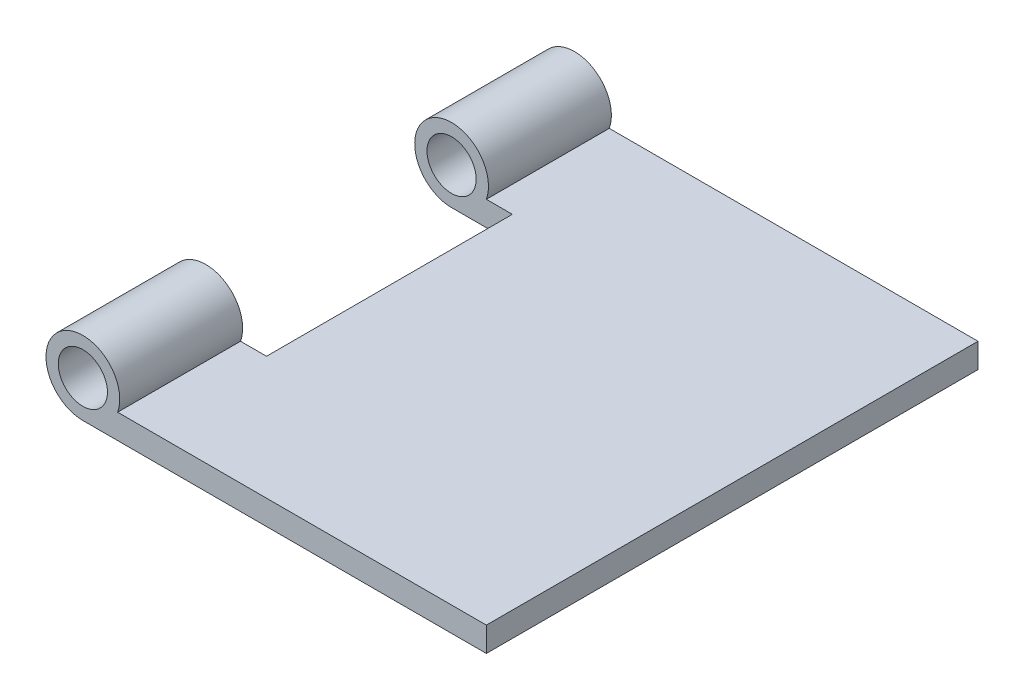
ISO-10303-21;
HEADER;
FILE_DESCRIPTION(('STEP AP214'),'2;1');
FILE_NAME('part.step','',(''),(''),'','','');
FILE_SCHEMA(('AUTOMOTIVE_DESIGN { 1 0 10303 214 1 1 1 1 }'));
ENDSEC;
DATA;
#1=APPLICATION_CONTEXT('core data for automotive mechanical design processes');
#2=APPLICATION_PROTOCOL_DEFINITION('international standard','automotive_design',2000,#1);
#3=PRODUCT_CONTEXT('',#1,'mechanical');
#4=PRODUCT('Part','Part','',(#3));
#5=PRODUCT_RELATED_PRODUCT_CATEGORY('part','',(#4));
#6=PRODUCT_DEFINITION_FORMATION('','',#4);
#7=PRODUCT_DEFINITION_CONTEXT('part definition',#1,'design');
#8=PRODUCT_DEFINITION('design','',#6,#7);
#9=PRODUCT_DEFINITION_SHAPE('','',#8);
#10=(LENGTH_UNIT() NAMED_UNIT(*) SI_UNIT(.MILLI.,.METRE.));
#11=(NAMED_UNIT(*) PLANE_ANGLE_UNIT() SI_UNIT($,.RADIAN.));
#12=(NAMED_UNIT(*) SI_UNIT($,.STERADIAN.) SOLID_ANGLE_UNIT());
#13=UNCERTAINTY_MEASURE_WITH_UNIT(LENGTH_MEASURE(1.E-05),#10,'distance_accuracy_value','');
#14=(GEOMETRIC_REPRESENTATION_CONTEXT(3) GLOBAL_UNCERTAINTY_ASSIGNED_CONTEXT((#13)) GLOBAL_UNIT_ASSIGNED_CONTEXT((#10,
#11,#12)) REPRESENTATION_CONTEXT('',''));
#15=CARTESIAN_POINT('',(0.,0.,0.));
#16=DIRECTION('',(0.,0.,1.));
#17=DIRECTION('',(1.,0.,0.));
#18=AXIS2_PLACEMENT_3D('',#15,#16,#17);
#19=CARTESIAN_POINT('',(0.,0.,40.));
#20=DIRECTION('',(0.,0.,-1.));
#21=DIRECTION('',(-1.,0.,0.));
#22=AXIS2_PLACEMENT_3D('',#19,#20,#21);
#23=CYLINDRICAL_SURFACE('',#22,3.);
#24=DIRECTION('',(0.,0.,-1.));
#25=VECTOR('',#24,1.);
#26=CARTESIAN_POINT('',(0.,-3.,40.));
#27=LINE('',#26,#25);
#28=CARTESIAN_POINT('',(0.,-3.,10.));
#29=VERTEX_POINT('',#28);
#30=CARTESIAN_POINT('',(0.,-3.,0.));
#31=VERTEX_POINT('',#30);
#32=EDGE_CURVE('E166',#29,#31,#27,.T.);
#33=ORIENTED_EDGE('',*,*,#32,.F.);
#34=CARTESIAN_POINT('',(0.,0.,10.));
#35=DIRECTION('',(0.,0.,-1.));
#36=DIRECTION('',(-1.,0.,0.));
#37=AXIS2_PLACEMENT_3D('',#34,#35,#36);
#38=CIRCLE('',#37,3.);
#39=CARTESIAN_POINT('',(2.82842712474619,-1.,10.));
#40=VERTEX_POINT('',#39);
#41=EDGE_CURVE('E135',#29,#40,#38,.T.);
#42=ORIENTED_EDGE('',*,*,#41,.T.);
#43=DIRECTION('',(0.,0.,-1.));
#44=VECTOR('',#43,1.);
#45=CARTESIAN_POINT('',(2.82842712474619,-1.,40.));
#46=LINE('',#45,#44);
#47=CARTESIAN_POINT('',(2.82842712474619,-1.,0.));
#48=VERTEX_POINT('',#47);
#49=EDGE_CURVE('E78',#40,#48,#46,.T.);
#50=ORIENTED_EDGE('',*,*,#49,.T.);
#51=CARTESIAN_POINT('',(0.,0.,0.));
#52=DIRECTION('',(0.,0.,1.));
#53=DIRECTION('',(1.,0.,0.));
#54=AXIS2_PLACEMENT_3D('',#51,#52,#53);
#55=CIRCLE('',#54,3.);
#56=EDGE_CURVE('E141',#48,#31,#55,.T.);
#57=ORIENTED_EDGE('',*,*,#56,.T.);
#58=EDGE_LOOP('',(#33,#42,#50,#57));
#59=FACE_BOUND('',#58,.T.);
#60=ADVANCED_FACE('F32',(#59),#23,.T.);
#61=CARTESIAN_POINT('',(0.,0.,40.));
#62=DIRECTION('',(0.,0.,-1.));
#63=DIRECTION('',(-1.,0.,0.));
#64=AXIS2_PLACEMENT_3D('',#61,#62,#63);
#65=CYLINDRICAL_SURFACE('',#64,2.);
#66=CARTESIAN_POINT('',(0.,0.,10.));
#67=DIRECTION('',(0.,0.,-1.));
#68=DIRECTION('',(-1.,0.,0.));
#69=AXIS2_PLACEMENT_3D('',#66,#67,#68);
#70=CIRCLE('',#69,2.);
#71=CARTESIAN_POINT('',(-2.,0.,10.));
#72=VERTEX_POINT('',#71);
#73=EDGE_CURVE('E126',#72,#72,#70,.T.);
#74=ORIENTED_EDGE('',*,*,#73,.F.);
#75=EDGE_LOOP('',(#74));
#76=FACE_BOUND('',#75,.T.);
#77=CARTESIAN_POINT('',(0.,0.,0.));
#78=DIRECTION('',(0.,0.,1.));
#79=DIRECTION('',(1.,0.,0.));
#80=AXIS2_PLACEMENT_3D('',#77,#78,#79);
#81=CIRCLE('',#80,2.);
#82=CARTESIAN_POINT('',(2.,0.,0.));
#83=VERTEX_POINT('',#82);
#84=EDGE_CURVE('E117',#83,#83,#81,.T.);
#85=ORIENTED_EDGE('',*,*,#84,.F.);
#86=EDGE_LOOP('',(#85));
#87=FACE_BOUND('',#86,.T.);
#88=ADVANCED_FACE('F200',(#76,#87),#65,.F.);
#89=CARTESIAN_POINT('',(0.,0.,40.));
#90=DIRECTION('',(0.,0.,1.));
#91=DIRECTION('',(1.,0.,0.));
#92=AXIS2_PLACEMENT_3D('',#89,#90,#91);
#93=PLANE('',#92);
#94=CARTESIAN_POINT('',(0.,0.,40.));
#95=DIRECTION('',(0.,0.,1.));
#96=DIRECTION('',(1.,0.,0.));
#97=AXIS2_PLACEMENT_3D('',#94,#95,#96);
#98=CIRCLE('',#97,3.);
#99=CARTESIAN_POINT('',(2.82842712474619,-1.,40.));
#100=VERTEX_POINT('',#99);
#101=CARTESIAN_POINT('',(0.,-3.,40.));
#102=VERTEX_POINT('',#101);
#103=EDGE_CURVE('E144',#100,#102,#98,.T.);
#104=ORIENTED_EDGE('',*,*,#103,.T.);
#105=DIRECTION('',(1.,0.,0.));
#106=VECTOR('',#105,1.);
#107=CARTESIAN_POINT('',(0.,-3.,40.));
#108=LINE('',#107,#106);
#109=CARTESIAN_POINT('',(32.8284271247462,-3.,40.));
#110=VERTEX_POINT('',#109);
#111=EDGE_CURVE('E86',#102,#110,#108,.T.);
#112=ORIENTED_EDGE('',*,*,#111,.T.);
#113=DIRECTION('',(0.,1.,0.));
#114=VECTOR('',#113,1.);
#115=CARTESIAN_POINT('',(32.8284271247462,-1.,40.));
#116=LINE('',#115,#114);
#117=CARTESIAN_POINT('',(32.8284271247462,-1.,40.));
#118=VERTEX_POINT('',#117);
#119=EDGE_CURVE('E148',#110,#118,#116,.T.);
#120=ORIENTED_EDGE('',*,*,#119,.T.);
#121=DIRECTION('',(-1.,0.,0.));
#122=VECTOR('',#121,1.);
#123=CARTESIAN_POINT('',(2.82842712474619,-1.,40.));
#124=LINE('',#123,#122);
#125=EDGE_CURVE('E56',#118,#100,#124,.T.);
#126=ORIENTED_EDGE('',*,*,#125,.T.);
#127=EDGE_LOOP('',(#104,#112,#120,#126));
#128=FACE_BOUND('',#127,.T.);
#129=CARTESIAN_POINT('',(0.,0.,40.));
#130=DIRECTION('',(0.,0.,1.));
#131=DIRECTION('',(1.,0.,0.));
#132=AXIS2_PLACEMENT_3D('',#129,#130,#131);
#133=CIRCLE('',#132,2.);
#134=CARTESIAN_POINT('',(2.,0.,40.));
#135=VERTEX_POINT('',#134);
#136=EDGE_CURVE('E138',#135,#135,#133,.T.);
#137=ORIENTED_EDGE('',*,*,#136,.F.);
#138=EDGE_LOOP('',(#137));
#139=FACE_BOUND('',#138,.T.);
#140=ADVANCED_FACE('F189',(#128,#139),#93,.T.);
#141=CARTESIAN_POINT('',(0.,0.,0.));
#142=DIRECTION('',(0.,0.,1.));
#143=DIRECTION('',(1.,0.,0.));
#144=AXIS2_PLACEMENT_3D('',#141,#142,#143);
#145=PLANE('',#144);
#146=ORIENTED_EDGE('',*,*,#56,.F.);
#147=DIRECTION('',(-1.,0.,0.));
#148=VECTOR('',#147,1.);
#149=CARTESIAN_POINT('',(2.82842712474619,-1.,0.));
#150=LINE('',#149,#148);
#151=CARTESIAN_POINT('',(32.8284271247462,-1.,0.));
#152=VERTEX_POINT('',#151);
#153=EDGE_CURVE('E146',#152,#48,#150,.T.);
#154=ORIENTED_EDGE('',*,*,#153,.F.);
#155=DIRECTION('',(0.,1.,0.));
#156=VECTOR('',#155,1.);
#157=CARTESIAN_POINT('',(32.8284271247462,-1.,0.));
#158=LINE('',#157,#156);
#159=CARTESIAN_POINT('',(32.8284271247462,-3.,0.));
#160=VERTEX_POINT('',#159);
#161=EDGE_CURVE('E154',#160,#152,#158,.T.);
#162=ORIENTED_EDGE('',*,*,#161,.F.);
#163=DIRECTION('',(1.,0.,0.));
#164=VECTOR('',#163,1.);
#165=CARTESIAN_POINT('',(0.,-3.,0.));
#166=LINE('',#165,#164);
#167=EDGE_CURVE('E152',#31,#160,#166,.T.);
#168=ORIENTED_EDGE('',*,*,#167,.F.);
#169=EDGE_LOOP('',(#146,#154,#162,#168));
#170=FACE_BOUND('',#169,.T.);
#171=ORIENTED_EDGE('',*,*,#84,.T.);
#172=EDGE_LOOP('',(#171));
#173=FACE_BOUND('',#172,.T.);
#174=ADVANCED_FACE('F183',(#170,#173),#145,.F.);
#175=CARTESIAN_POINT('',(2.82842712474619,-1.,30.));
#176=VERTEX_POINT('',#175);
#177=EDGE_CURVE('E157',#100,#176,#46,.T.);
#178=ORIENTED_EDGE('',*,*,#177,.T.);
#179=CARTESIAN_POINT('',(0.,0.,30.));
#180=DIRECTION('',(0.,0.,1.));
#181=DIRECTION('',(1.,0.,0.));
#182=AXIS2_PLACEMENT_3D('',#179,#180,#181);
#183=CIRCLE('',#182,3.);
#184=CARTESIAN_POINT('',(0.,-3.,30.));
#185=VERTEX_POINT('',#184);
#186=EDGE_CURVE('E47',#176,#185,#183,.T.);
#187=ORIENTED_EDGE('',*,*,#186,.T.);
#188=EDGE_CURVE('E40',#102,#185,#27,.T.);
#189=ORIENTED_EDGE('',*,*,#188,.F.);
#190=ORIENTED_EDGE('',*,*,#103,.F.);
#191=EDGE_LOOP('',(#178,#187,#189,#190));
#192=FACE_BOUND('',#191,.T.);
#193=ADVANCED_FACE('F34',(#192),#23,.T.);
#194=CARTESIAN_POINT('',(0.,-3.,40.));
#195=DIRECTION('',(0.,1.,0.));
#196=DIRECTION('',(0.,0.,1.));
#197=AXIS2_PLACEMENT_3D('',#194,#195,#196);
#198=PLANE('',#197);
#199=DIRECTION('',(0.,0.,-1.));
#200=VECTOR('',#199,1.);
#201=CARTESIAN_POINT('',(4.94304546899934,-3.,40.));
#202=LINE('',#201,#200);
#203=CARTESIAN_POINT('',(4.94304546899934,-3.,30.));
#204=VERTEX_POINT('',#203);
#205=CARTESIAN_POINT('',(4.94304546899934,-3.,10.));
#206=VERTEX_POINT('',#205);
#207=EDGE_CURVE('E109',#204,#206,#202,.T.);
#208=ORIENTED_EDGE('',*,*,#207,.T.);
#209=DIRECTION('',(-1.,0.,0.));
#210=VECTOR('',#209,1.);
#211=CARTESIAN_POINT('',(0.,-3.,10.));
#212=LINE('',#211,#210);
#213=EDGE_CURVE('E118',#206,#29,#212,.T.);
#214=ORIENTED_EDGE('',*,*,#213,.T.);
#215=ORIENTED_EDGE('',*,*,#32,.T.);
#216=ORIENTED_EDGE('',*,*,#167,.T.);
#217=DIRECTION('',(0.,0.,-1.));
#218=VECTOR('',#217,1.);
#219=CARTESIAN_POINT('',(32.8284271247462,-3.,40.));
#220=LINE('',#219,#218);
#221=EDGE_CURVE('E163',#110,#160,#220,.T.);
#222=ORIENTED_EDGE('',*,*,#221,.F.);
#223=ORIENTED_EDGE('',*,*,#111,.F.);
#224=ORIENTED_EDGE('',*,*,#188,.T.);
#225=DIRECTION('',(1.,0.,0.));
#226=VECTOR('',#225,1.);
#227=CARTESIAN_POINT('',(0.,-3.,30.));
#228=LINE('',#227,#226);
#229=EDGE_CURVE('E121',#185,#204,#228,.T.);
#230=ORIENTED_EDGE('',*,*,#229,.T.);
#231=EDGE_LOOP('',(#208,#214,#215,#216,#222,#223,#224,#230));
#232=FACE_BOUND('',#231,.T.);
#233=ADVANCED_FACE('F124',(#232),#198,.F.);
#234=CARTESIAN_POINT('',(32.8284271247462,-1.,40.));
#235=DIRECTION('',(-1.,0.,0.));
#236=DIRECTION('',(0.,0.,1.));
#237=AXIS2_PLACEMENT_3D('',#234,#235,#236);
#238=PLANE('',#237);
#239=ORIENTED_EDGE('',*,*,#161,.T.);
#240=DIRECTION('',(0.,0.,-1.));
#241=VECTOR('',#240,1.);
#242=CARTESIAN_POINT('',(32.8284271247462,-1.,40.));
#243=LINE('',#242,#241);
#244=EDGE_CURVE('E160',#118,#152,#243,.T.);
#245=ORIENTED_EDGE('',*,*,#244,.F.);
#246=ORIENTED_EDGE('',*,*,#119,.F.);
#247=ORIENTED_EDGE('',*,*,#221,.T.);
#248=EDGE_LOOP('',(#239,#245,#246,#247));
#249=FACE_BOUND('',#248,.T.);
#250=ADVANCED_FACE('F188',(#249),#238,.F.);
#251=CARTESIAN_POINT('',(2.82842712474619,-1.,40.));
#252=DIRECTION('',(0.,-1.,0.));
#253=DIRECTION('',(0.,0.,-1.));
#254=AXIS2_PLACEMENT_3D('',#251,#252,#253);
#255=PLANE('',#254);
#256=ORIENTED_EDGE('',*,*,#49,.F.);
#257=DIRECTION('',(1.,0.,0.));
#258=VECTOR('',#257,1.);
#259=CARTESIAN_POINT('',(2.82842712474619,-1.,10.));
#260=LINE('',#259,#258);
#261=CARTESIAN_POINT('',(4.94304546899934,-1.,10.));
#262=VERTEX_POINT('',#261);
#263=EDGE_CURVE('E129',#40,#262,#260,.T.);
#264=ORIENTED_EDGE('',*,*,#263,.T.);
#265=DIRECTION('',(0.,0.,1.));
#266=VECTOR('',#265,1.);
#267=CARTESIAN_POINT('',(4.94304546899934,-1.,40.));
#268=LINE('',#267,#266);
#269=CARTESIAN_POINT('',(4.94304546899934,-1.,30.));
#270=VERTEX_POINT('',#269);
#271=EDGE_CURVE('E11',#262,#270,#268,.T.);
#272=ORIENTED_EDGE('',*,*,#271,.T.);
#273=DIRECTION('',(-1.,0.,0.));
#274=VECTOR('',#273,1.);
#275=CARTESIAN_POINT('',(2.82842712474619,-1.,30.));
#276=LINE('',#275,#274);
#277=EDGE_CURVE('E122',#270,#176,#276,.T.);
#278=ORIENTED_EDGE('',*,*,#277,.T.);
#279=ORIENTED_EDGE('',*,*,#177,.F.);
#280=ORIENTED_EDGE('',*,*,#125,.F.);
#281=ORIENTED_EDGE('',*,*,#244,.T.);
#282=ORIENTED_EDGE('',*,*,#153,.T.);
#283=EDGE_LOOP('',(#256,#264,#272,#278,#279,#280,#281,#282));
#284=FACE_BOUND('',#283,.T.);
#285=ADVANCED_FACE('F176',(#284),#255,.F.);
#286=CARTESIAN_POINT('',(0.,0.,30.));
#287=DIRECTION('',(0.,0.,1.));
#288=DIRECTION('',(1.,0.,0.));
#289=AXIS2_PLACEMENT_3D('',#286,#287,#288);
#290=CIRCLE('',#289,2.);
#291=CARTESIAN_POINT('',(2.,0.,30.));
#292=VERTEX_POINT('',#291);
#293=EDGE_CURVE('E168',#292,#292,#290,.T.);
#294=ORIENTED_EDGE('',*,*,#293,.F.);
#295=EDGE_LOOP('',(#294));
#296=FACE_BOUND('',#295,.T.);
#297=ORIENTED_EDGE('',*,*,#136,.T.);
#298=EDGE_LOOP('',(#297));
#299=FACE_BOUND('',#298,.T.);
#300=ADVANCED_FACE('F206',(#296,#299),#65,.F.);
#301=CARTESIAN_POINT('',(4.94304546899934,-20.,10.));
#302=DIRECTION('',(1.,0.,0.));
#303=DIRECTION('',(0.,0.,-1.));
#304=AXIS2_PLACEMENT_3D('',#301,#302,#303);
#305=PLANE('',#304);
#306=DIRECTION('',(0.,1.,0.));
#307=VECTOR('',#306,1.);
#308=CARTESIAN_POINT('',(4.94304546899934,-20.,30.));
#309=LINE('',#308,#307);
#310=EDGE_CURVE('E112',#204,#270,#309,.T.);
#311=ORIENTED_EDGE('',*,*,#310,.T.);
#312=ORIENTED_EDGE('',*,*,#271,.F.);
#313=DIRECTION('',(0.,1.,0.));
#314=VECTOR('',#313,1.);
#315=CARTESIAN_POINT('',(4.94304546899934,-20.,10.));
#316=LINE('',#315,#314);
#317=EDGE_CURVE('E114',#206,#262,#316,.T.);
#318=ORIENTED_EDGE('',*,*,#317,.F.);
#319=ORIENTED_EDGE('',*,*,#207,.F.);
#320=EDGE_LOOP('',(#311,#312,#318,#319));
#321=FACE_BOUND('',#320,.T.);
#322=ADVANCED_FACE('F111',(#321),#305,.F.);
#323=CARTESIAN_POINT('',(-5.83359302746032,-20.,10.));
#324=DIRECTION('',(0.,0.,-1.));
#325=DIRECTION('',(-1.,0.,0.));
#326=AXIS2_PLACEMENT_3D('',#323,#324,#325);
#327=PLANE('',#326);
#328=ORIENTED_EDGE('',*,*,#73,.T.);
#329=EDGE_LOOP('',(#328));
#330=FACE_BOUND('',#329,.T.);
#331=ORIENTED_EDGE('',*,*,#317,.T.);
#332=ORIENTED_EDGE('',*,*,#263,.F.);
#333=ORIENTED_EDGE('',*,*,#41,.F.);
#334=ORIENTED_EDGE('',*,*,#213,.F.);
#335=EDGE_LOOP('',(#331,#332,#333,#334));
#336=FACE_BOUND('',#335,.T.);
#337=ADVANCED_FACE('F174',(#330,#336),#327,.F.);
#338=CARTESIAN_POINT('',(-5.83359302746032,-20.,30.));
#339=DIRECTION('',(0.,0.,1.));
#340=DIRECTION('',(1.,0.,0.));
#341=AXIS2_PLACEMENT_3D('',#338,#339,#340);
#342=PLANE('',#341);
#343=ORIENTED_EDGE('',*,*,#293,.T.);
#344=EDGE_LOOP('',(#343));
#345=FACE_BOUND('',#344,.T.);
#346=ORIENTED_EDGE('',*,*,#186,.F.);
#347=ORIENTED_EDGE('',*,*,#277,.F.);
#348=ORIENTED_EDGE('',*,*,#310,.F.);
#349=ORIENTED_EDGE('',*,*,#229,.F.);
#350=EDGE_LOOP('',(#346,#347,#348,#349));
#351=FACE_BOUND('',#350,.T.);
#352=ADVANCED_FACE('F120',(#345,#351),#342,.F.);
#353=CLOSED_SHELL('',(#60,#88,#140,#174,#193,#233,#250,#285,#300,#322,#337,#352));
#354=MANIFOLD_SOLID_BREP('B2',#353);
#355=ADVANCED_BREP_SHAPE_REPRESENTATION('',(#18,#354),#14);
#356=SHAPE_DEFINITION_REPRESENTATION(#9,#355);
ENDSEC;
END-ISO-10303-21;
